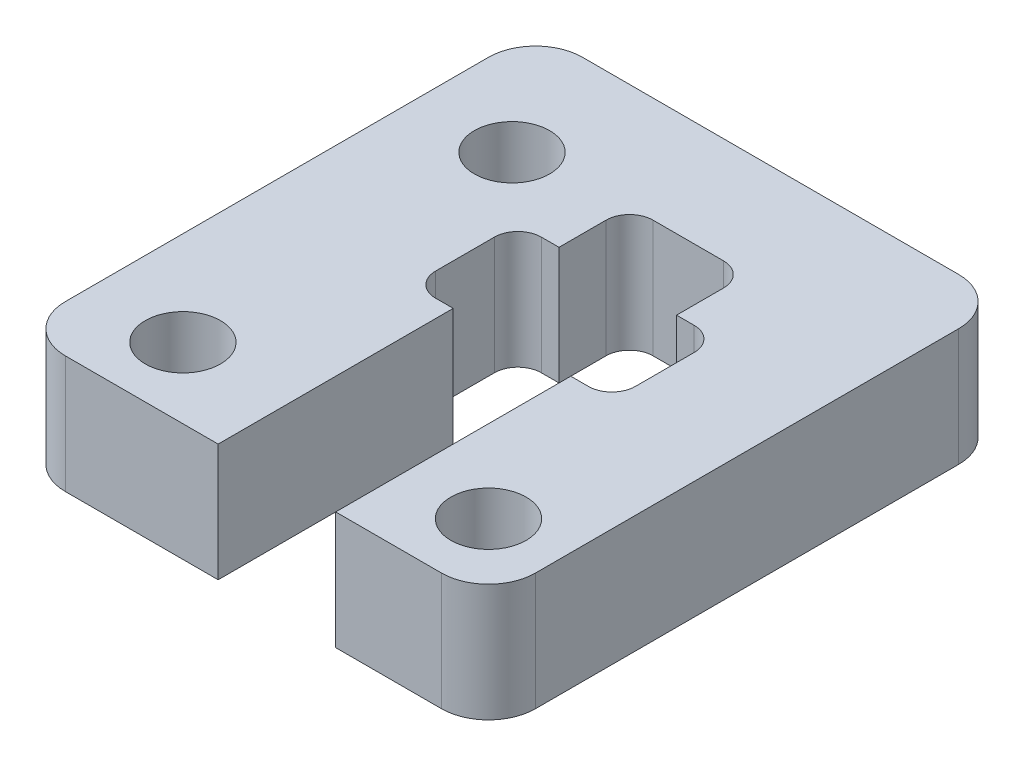
ISO-10303-21;
HEADER;
FILE_DESCRIPTION(('STEP AP214'),'2;1');
FILE_NAME('part.step','',(''),(''),'','','');
FILE_SCHEMA(('AUTOMOTIVE_DESIGN { 1 0 10303 214 1 1 1 1 }'));
ENDSEC;
DATA;
#1=APPLICATION_CONTEXT('core data for automotive mechanical design processes');
#2=APPLICATION_PROTOCOL_DEFINITION('international standard','automotive_design',2000,#1);
#3=PRODUCT_CONTEXT('',#1,'mechanical');
#4=PRODUCT('Part','Part','',(#3));
#5=PRODUCT_RELATED_PRODUCT_CATEGORY('part','',(#4));
#6=PRODUCT_DEFINITION_FORMATION('','',#4);
#7=PRODUCT_DEFINITION_CONTEXT('part definition',#1,'design');
#8=PRODUCT_DEFINITION('design','',#6,#7);
#9=PRODUCT_DEFINITION_SHAPE('','',#8);
#10=(LENGTH_UNIT() NAMED_UNIT(*) SI_UNIT(.MILLI.,.METRE.));
#11=(NAMED_UNIT(*) PLANE_ANGLE_UNIT() SI_UNIT($,.RADIAN.));
#12=(NAMED_UNIT(*) SI_UNIT($,.STERADIAN.) SOLID_ANGLE_UNIT());
#13=UNCERTAINTY_MEASURE_WITH_UNIT(LENGTH_MEASURE(1.E-05),#10,'distance_accuracy_value','');
#14=(GEOMETRIC_REPRESENTATION_CONTEXT(3) GLOBAL_UNCERTAINTY_ASSIGNED_CONTEXT((#13)) GLOBAL_UNIT_ASSIGNED_CONTEXT((#10,
#11,#12)) REPRESENTATION_CONTEXT('',''));
#15=CARTESIAN_POINT('',(0.,0.,0.));
#16=DIRECTION('',(0.,0.,1.));
#17=DIRECTION('',(1.,0.,0.));
#18=AXIS2_PLACEMENT_3D('',#15,#16,#17);
#19=CARTESIAN_POINT('',(0.,5.,0.));
#20=DIRECTION('',(0.,0.,-1.));
#21=DIRECTION('',(-1.,0.,0.));
#22=AXIS2_PLACEMENT_3D('',#19,#20,#21);
#23=PLANE('',#22);
#24=DIRECTION('',(1.,0.,0.));
#25=VECTOR('',#24,1.);
#26=CARTESIAN_POINT('',(0.,5.,0.));
#27=LINE('',#26,#25);
#28=CARTESIAN_POINT('',(3.5,5.,0.));
#29=VERTEX_POINT('',#28);
#30=CARTESIAN_POINT('',(4.25,5.,0.));
#31=VERTEX_POINT('',#30);
#32=EDGE_CURVE('E229',#29,#31,#27,.T.);
#33=ORIENTED_EDGE('',*,*,#32,.T.);
#34=DIRECTION('',(0.,-1.,0.));
#35=VECTOR('',#34,1.);
#36=CARTESIAN_POINT('',(4.25,0.,0.));
#37=LINE('',#36,#35);
#38=CARTESIAN_POINT('',(4.25,0.,0.));
#39=VERTEX_POINT('',#38);
#40=EDGE_CURVE('E352',#31,#39,#37,.T.);
#41=ORIENTED_EDGE('',*,*,#40,.T.);
#42=DIRECTION('',(1.,0.,0.));
#43=VECTOR('',#42,1.);
#44=CARTESIAN_POINT('',(0.,0.,0.));
#45=LINE('',#44,#43);
#46=CARTESIAN_POINT('',(3.5,0.,0.));
#47=VERTEX_POINT('',#46);
#48=EDGE_CURVE('E281',#47,#39,#45,.T.);
#49=ORIENTED_EDGE('',*,*,#48,.F.);
#50=DIRECTION('',(0.,-1.,0.));
#51=VECTOR('',#50,1.);
#52=CARTESIAN_POINT('',(3.5,5.,0.));
#53=LINE('',#52,#51);
#54=EDGE_CURVE('E266',#29,#47,#53,.T.);
#55=ORIENTED_EDGE('',*,*,#54,.F.);
#56=EDGE_LOOP('',(#33,#41,#49,#55));
#57=FACE_BOUND('',#56,.T.);
#58=ADVANCED_FACE('F36',(#57),#23,.T.);
#59=CARTESIAN_POINT('',(0.,5.,-4.5));
#60=DIRECTION('',(0.,0.,-1.));
#61=DIRECTION('',(-1.,0.,0.));
#62=AXIS2_PLACEMENT_3D('',#59,#60,#61);
#63=PLANE('',#62);
#64=DIRECTION('',(1.,0.,0.));
#65=VECTOR('',#64,1.);
#66=CARTESIAN_POINT('',(0.,0.,-4.5));
#67=LINE('',#66,#65);
#68=CARTESIAN_POINT('',(3.5,0.,-4.5));
#69=VERTEX_POINT('',#68);
#70=CARTESIAN_POINT('',(4.25,0.,-4.5));
#71=VERTEX_POINT('',#70);
#72=EDGE_CURVE('E287',#69,#71,#67,.T.);
#73=ORIENTED_EDGE('',*,*,#72,.T.);
#74=DIRECTION('',(0.,-1.,0.));
#75=VECTOR('',#74,1.);
#76=CARTESIAN_POINT('',(4.25,5.,-4.5));
#77=LINE('',#76,#75);
#78=CARTESIAN_POINT('',(4.25,5.,-4.5));
#79=VERTEX_POINT('',#78);
#80=EDGE_CURVE('E350',#71,#79,#77,.F.);
#81=ORIENTED_EDGE('',*,*,#80,.T.);
#82=DIRECTION('',(1.,0.,0.));
#83=VECTOR('',#82,1.);
#84=CARTESIAN_POINT('',(0.,5.,-4.5));
#85=LINE('',#84,#83);
#86=CARTESIAN_POINT('',(3.5,5.,-4.5));
#87=VERTEX_POINT('',#86);
#88=EDGE_CURVE('E252',#87,#79,#85,.T.);
#89=ORIENTED_EDGE('',*,*,#88,.F.);
#90=DIRECTION('',(0.,-1.,0.));
#91=VECTOR('',#90,1.);
#92=CARTESIAN_POINT('',(3.5,5.,-4.5));
#93=LINE('',#92,#91);
#94=EDGE_CURVE('E419',#87,#69,#93,.T.);
#95=ORIENTED_EDGE('',*,*,#94,.T.);
#96=EDGE_LOOP('',(#73,#81,#89,#95));
#97=FACE_BOUND('',#96,.T.);
#98=ADVANCED_FACE('F469',(#97),#63,.F.);
#99=CARTESIAN_POINT('',(0.,5.,10.));
#100=DIRECTION('',(0.,0.,-1.));
#101=DIRECTION('',(-1.,0.,0.));
#102=AXIS2_PLACEMENT_3D('',#99,#100,#101);
#103=PLANE('',#102);
#104=DIRECTION('',(1.,0.,0.));
#105=VECTOR('',#104,1.);
#106=CARTESIAN_POINT('',(0.,0.,10.));
#107=LINE('',#106,#105);
#108=CARTESIAN_POINT('',(3.5,0.,10.));
#109=VERTEX_POINT('',#108);
#110=CARTESIAN_POINT('',(8.,0.,10.));
#111=VERTEX_POINT('',#110);
#112=EDGE_CURVE('E275',#109,#111,#107,.T.);
#113=ORIENTED_EDGE('',*,*,#112,.T.);
#114=DIRECTION('',(0.,-1.,0.));
#115=VECTOR('',#114,1.);
#116=CARTESIAN_POINT('',(8.,5.,10.));
#117=LINE('',#116,#115);
#118=CARTESIAN_POINT('',(8.,5.,10.));
#119=VERTEX_POINT('',#118);
#120=EDGE_CURVE('E235',#111,#119,#117,.F.);
#121=ORIENTED_EDGE('',*,*,#120,.T.);
#122=DIRECTION('',(1.,0.,0.));
#123=VECTOR('',#122,1.);
#124=CARTESIAN_POINT('',(0.,5.,10.));
#125=LINE('',#124,#123);
#126=CARTESIAN_POINT('',(3.5,5.,10.));
#127=VERTEX_POINT('',#126);
#128=EDGE_CURVE('E226',#127,#119,#125,.T.);
#129=ORIENTED_EDGE('',*,*,#128,.F.);
#130=DIRECTION('',(0.,-1.,0.));
#131=VECTOR('',#130,1.);
#132=CARTESIAN_POINT('',(3.5,5.,10.));
#133=LINE('',#132,#131);
#134=EDGE_CURVE('E206',#127,#109,#133,.T.);
#135=ORIENTED_EDGE('',*,*,#134,.T.);
#136=EDGE_LOOP('',(#113,#121,#129,#135));
#137=FACE_BOUND('',#136,.T.);
#138=ADVANCED_FACE('F233',(#137),#103,.F.);
#139=CARTESIAN_POINT('',(5.25,5.,0.));
#140=DIRECTION('',(-1.,0.,0.));
#141=DIRECTION('',(0.,0.,1.));
#142=AXIS2_PLACEMENT_3D('',#139,#140,#141);
#143=PLANE('',#142);
#144=DIRECTION('',(0.,0.,-1.));
#145=VECTOR('',#144,1.);
#146=CARTESIAN_POINT('',(5.25,5.,0.));
#147=LINE('',#146,#145);
#148=CARTESIAN_POINT('',(5.25,5.,-1.));
#149=VERTEX_POINT('',#148);
#150=CARTESIAN_POINT('',(5.25,5.,-3.5));
#151=VERTEX_POINT('',#150);
#152=EDGE_CURVE('E239',#149,#151,#147,.T.);
#153=ORIENTED_EDGE('',*,*,#152,.T.);
#154=DIRECTION('',(0.,-1.,0.));
#155=VECTOR('',#154,1.);
#156=CARTESIAN_POINT('',(5.25,5.,-3.5));
#157=LINE('',#156,#155);
#158=CARTESIAN_POINT('',(5.25,0.,-3.5));
#159=VERTEX_POINT('',#158);
#160=EDGE_CURVE('E347',#151,#159,#157,.T.);
#161=ORIENTED_EDGE('',*,*,#160,.T.);
#162=DIRECTION('',(0.,0.,-1.));
#163=VECTOR('',#162,1.);
#164=CARTESIAN_POINT('',(5.25,0.,0.));
#165=LINE('',#164,#163);
#166=CARTESIAN_POINT('',(5.25,0.,-1.));
#167=VERTEX_POINT('',#166);
#168=EDGE_CURVE('E278',#167,#159,#165,.T.);
#169=ORIENTED_EDGE('',*,*,#168,.F.);
#170=DIRECTION('',(0.,-1.,0.));
#171=VECTOR('',#170,1.);
#172=CARTESIAN_POINT('',(5.25,5.,-1.));
#173=LINE('',#172,#171);
#174=EDGE_CURVE('E345',#167,#149,#173,.F.);
#175=ORIENTED_EDGE('',*,*,#174,.T.);
#176=EDGE_LOOP('',(#153,#161,#169,#175));
#177=FACE_BOUND('',#176,.T.);
#178=ADVANCED_FACE('F458',(#177),#143,.T.);
#179=CARTESIAN_POINT('',(-2.25,0.,0.));
#180=VERTEX_POINT('',#179);
#181=CARTESIAN_POINT('',(-1.5,0.,0.));
#182=VERTEX_POINT('',#181);
#183=EDGE_CURVE('E282',#180,#182,#45,.T.);
#184=ORIENTED_EDGE('',*,*,#183,.F.);
#185=DIRECTION('',(0.,-1.,0.));
#186=VECTOR('',#185,1.);
#187=CARTESIAN_POINT('',(-2.25,5.,0.));
#188=LINE('',#187,#186);
#189=CARTESIAN_POINT('',(-2.25,5.,0.));
#190=VERTEX_POINT('',#189);
#191=EDGE_CURVE('E51',#180,#190,#188,.F.);
#192=ORIENTED_EDGE('',*,*,#191,.T.);
#193=CARTESIAN_POINT('',(-1.5,5.,0.));
#194=VERTEX_POINT('',#193);
#195=EDGE_CURVE('E247',#190,#194,#27,.T.);
#196=ORIENTED_EDGE('',*,*,#195,.T.);
#197=DIRECTION('',(0.,1.,0.));
#198=VECTOR('',#197,1.);
#199=CARTESIAN_POINT('',(-1.5,5.,0.));
#200=LINE('',#199,#198);
#201=EDGE_CURVE('E411',#182,#194,#200,.T.);
#202=ORIENTED_EDGE('',*,*,#201,.F.);
#203=EDGE_LOOP('',(#184,#192,#196,#202));
#204=FACE_BOUND('',#203,.T.);
#205=ADVANCED_FACE('F410',(#204),#23,.T.);
#206=CARTESIAN_POINT('',(-3.25,5.,0.));
#207=DIRECTION('',(-1.,0.,0.));
#208=DIRECTION('',(0.,0.,1.));
#209=AXIS2_PLACEMENT_3D('',#206,#207,#208);
#210=PLANE('',#209);
#211=DIRECTION('',(0.,0.,-1.));
#212=VECTOR('',#211,1.);
#213=CARTESIAN_POINT('',(-3.25,0.,0.));
#214=LINE('',#213,#212);
#215=CARTESIAN_POINT('',(-3.25,0.,-1.));
#216=VERTEX_POINT('',#215);
#217=CARTESIAN_POINT('',(-3.25,0.,-3.5));
#218=VERTEX_POINT('',#217);
#219=EDGE_CURVE('E284',#216,#218,#214,.T.);
#220=ORIENTED_EDGE('',*,*,#219,.T.);
#221=DIRECTION('',(0.,-1.,0.));
#222=VECTOR('',#221,1.);
#223=CARTESIAN_POINT('',(-3.25,5.,-3.5));
#224=LINE('',#223,#222);
#225=CARTESIAN_POINT('',(-3.25,5.,-3.5));
#226=VERTEX_POINT('',#225);
#227=EDGE_CURVE('E361',#218,#226,#224,.F.);
#228=ORIENTED_EDGE('',*,*,#227,.T.);
#229=DIRECTION('',(0.,0.,-1.));
#230=VECTOR('',#229,1.);
#231=CARTESIAN_POINT('',(-3.25,5.,0.));
#232=LINE('',#231,#230);
#233=CARTESIAN_POINT('',(-3.25,5.,-1.));
#234=VERTEX_POINT('',#233);
#235=EDGE_CURVE('E249',#234,#226,#232,.T.);
#236=ORIENTED_EDGE('',*,*,#235,.F.);
#237=DIRECTION('',(0.,-1.,0.));
#238=VECTOR('',#237,1.);
#239=CARTESIAN_POINT('',(-3.25,5.,-1.));
#240=LINE('',#239,#238);
#241=EDGE_CURVE('E358',#234,#216,#240,.T.);
#242=ORIENTED_EDGE('',*,*,#241,.T.);
#243=EDGE_LOOP('',(#220,#228,#236,#242));
#244=FACE_BOUND('',#243,.T.);
#245=ADVANCED_FACE('F401',(#244),#210,.F.);
#246=CARTESIAN_POINT('',(10.,5.,0.));
#247=DIRECTION('',(1.,0.,0.));
#248=DIRECTION('',(0.,0.,-1.));
#249=AXIS2_PLACEMENT_3D('',#246,#247,#248);
#250=PLANE('',#249);
#251=DIRECTION('',(0.,0.,1.));
#252=VECTOR('',#251,1.);
#253=CARTESIAN_POINT('',(10.,0.,0.));
#254=LINE('',#253,#252);
#255=CARTESIAN_POINT('',(10.,0.,-10.));
#256=VERTEX_POINT('',#255);
#257=CARTESIAN_POINT('',(10.,0.,8.));
#258=VERTEX_POINT('',#257);
#259=EDGE_CURVE('E265',#256,#258,#254,.T.);
#260=ORIENTED_EDGE('',*,*,#259,.F.);
#261=DIRECTION('',(0.,-1.,0.));
#262=VECTOR('',#261,1.);
#263=CARTESIAN_POINT('',(10.,5.,-10.));
#264=LINE('',#263,#262);
#265=CARTESIAN_POINT('',(10.,5.,-10.));
#266=VERTEX_POINT('',#265);
#267=EDGE_CURVE('E316',#256,#266,#264,.F.);
#268=ORIENTED_EDGE('',*,*,#267,.T.);
#269=DIRECTION('',(0.,0.,1.));
#270=VECTOR('',#269,1.);
#271=CARTESIAN_POINT('',(10.,5.,0.));
#272=LINE('',#271,#270);
#273=CARTESIAN_POINT('',(10.,5.,8.));
#274=VERTEX_POINT('',#273);
#275=EDGE_CURVE('E428',#266,#274,#272,.T.);
#276=ORIENTED_EDGE('',*,*,#275,.T.);
#277=DIRECTION('',(0.,-1.,0.));
#278=VECTOR('',#277,1.);
#279=CARTESIAN_POINT('',(10.,0.,8.));
#280=LINE('',#279,#278);
#281=EDGE_CURVE('E313',#274,#258,#280,.T.);
#282=ORIENTED_EDGE('',*,*,#281,.T.);
#283=EDGE_LOOP('',(#260,#268,#276,#282));
#284=FACE_BOUND('',#283,.T.);
#285=ADVANCED_FACE('F444',(#284),#250,.T.);
#286=CARTESIAN_POINT('',(0.,5.,-12.));
#287=DIRECTION('',(0.,0.,-1.));
#288=DIRECTION('',(-1.,0.,0.));
#289=AXIS2_PLACEMENT_3D('',#286,#287,#288);
#290=PLANE('',#289);
#291=DIRECTION('',(1.,0.,0.));
#292=VECTOR('',#291,1.);
#293=CARTESIAN_POINT('',(0.,5.,-12.));
#294=LINE('',#293,#292);
#295=CARTESIAN_POINT('',(-8.,5.,-12.));
#296=VERTEX_POINT('',#295);
#297=CARTESIAN_POINT('',(8.,5.,-12.));
#298=VERTEX_POINT('',#297);
#299=EDGE_CURVE('E241',#296,#298,#294,.T.);
#300=ORIENTED_EDGE('',*,*,#299,.T.);
#301=DIRECTION('',(0.,-1.,0.));
#302=VECTOR('',#301,1.);
#303=CARTESIAN_POINT('',(8.,5.,-12.));
#304=LINE('',#303,#302);
#305=CARTESIAN_POINT('',(8.,0.,-12.));
#306=VERTEX_POINT('',#305);
#307=EDGE_CURVE('E302',#298,#306,#304,.T.);
#308=ORIENTED_EDGE('',*,*,#307,.T.);
#309=DIRECTION('',(1.,0.,0.));
#310=VECTOR('',#309,1.);
#311=CARTESIAN_POINT('',(0.,0.,-12.));
#312=LINE('',#311,#310);
#313=CARTESIAN_POINT('',(-8.,0.,-12.));
#314=VERTEX_POINT('',#313);
#315=EDGE_CURVE('E269',#314,#306,#312,.T.);
#316=ORIENTED_EDGE('',*,*,#315,.F.);
#317=DIRECTION('',(0.,-1.,0.));
#318=VECTOR('',#317,1.);
#319=CARTESIAN_POINT('',(-8.,5.,-12.));
#320=LINE('',#319,#318);
#321=EDGE_CURVE('E300',#314,#296,#320,.F.);
#322=ORIENTED_EDGE('',*,*,#321,.T.);
#323=EDGE_LOOP('',(#300,#308,#316,#322));
#324=FACE_BOUND('',#323,.T.);
#325=ADVANCED_FACE('F434',(#324),#290,.T.);
#326=CARTESIAN_POINT('',(-10.,5.,0.));
#327=DIRECTION('',(-1.,0.,0.));
#328=DIRECTION('',(0.,0.,1.));
#329=AXIS2_PLACEMENT_3D('',#326,#327,#328);
#330=PLANE('',#329);
#331=DIRECTION('',(0.,0.,-1.));
#332=VECTOR('',#331,1.);
#333=CARTESIAN_POINT('',(-10.,5.,0.));
#334=LINE('',#333,#332);
#335=CARTESIAN_POINT('',(-10.,5.,8.));
#336=VERTEX_POINT('',#335);
#337=CARTESIAN_POINT('',(-10.,5.,-10.));
#338=VERTEX_POINT('',#337);
#339=EDGE_CURVE('E237',#336,#338,#334,.T.);
#340=ORIENTED_EDGE('',*,*,#339,.T.);
#341=DIRECTION('',(0.,-1.,0.));
#342=VECTOR('',#341,1.);
#343=CARTESIAN_POINT('',(-10.,5.,-10.));
#344=LINE('',#343,#342);
#345=CARTESIAN_POINT('',(-10.,0.,-10.));
#346=VERTEX_POINT('',#345);
#347=EDGE_CURVE('E328',#338,#346,#344,.T.);
#348=ORIENTED_EDGE('',*,*,#347,.T.);
#349=DIRECTION('',(0.,0.,-1.));
#350=VECTOR('',#349,1.);
#351=CARTESIAN_POINT('',(-10.,0.,0.));
#352=LINE('',#351,#350);
#353=CARTESIAN_POINT('',(-10.,0.,8.));
#354=VERTEX_POINT('',#353);
#355=EDGE_CURVE('E272',#354,#346,#352,.T.);
#356=ORIENTED_EDGE('',*,*,#355,.F.);
#357=DIRECTION('',(0.,-1.,0.));
#358=VECTOR('',#357,1.);
#359=CARTESIAN_POINT('',(-10.,5.,8.));
#360=LINE('',#359,#358);
#361=EDGE_CURVE('E326',#354,#336,#360,.F.);
#362=ORIENTED_EDGE('',*,*,#361,.T.);
#363=EDGE_LOOP('',(#340,#348,#356,#362));
#364=FACE_BOUND('',#363,.T.);
#365=ADVANCED_FACE('F497',(#364),#330,.T.);
#366=CARTESIAN_POINT('',(-6.,5.,-7.));
#367=DIRECTION('',(0.,-1.,0.));
#368=DIRECTION('',(0.,0.,-1.));
#369=AXIS2_PLACEMENT_3D('',#366,#367,#368);
#370=CYLINDRICAL_SURFACE('',#369,1.6);
#371=CARTESIAN_POINT('',(-6.,5.,-7.));
#372=DIRECTION('',(0.,1.,0.));
#373=DIRECTION('',(0.,0.,1.));
#374=AXIS2_PLACEMENT_3D('',#371,#372,#373);
#375=CIRCLE('',#374,1.6);
#376=CARTESIAN_POINT('',(-6.,5.,-5.4));
#377=VERTEX_POINT('',#376);
#378=EDGE_CURVE('E255',#377,#377,#375,.T.);
#379=ORIENTED_EDGE('',*,*,#378,.T.);
#380=EDGE_LOOP('',(#379));
#381=FACE_BOUND('',#380,.T.);
#382=CARTESIAN_POINT('',(-6.,0.,-7.));
#383=DIRECTION('',(0.,1.,0.));
#384=DIRECTION('',(0.,0.,1.));
#385=AXIS2_PLACEMENT_3D('',#382,#383,#384);
#386=CIRCLE('',#385,1.6);
#387=CARTESIAN_POINT('',(-6.,0.,-5.4));
#388=VERTEX_POINT('',#387);
#389=EDGE_CURVE('E290',#388,#388,#386,.T.);
#390=ORIENTED_EDGE('',*,*,#389,.F.);
#391=EDGE_LOOP('',(#390));
#392=FACE_BOUND('',#391,.T.);
#393=ADVANCED_FACE('F531',(#381,#392),#370,.F.);
#394=CARTESIAN_POINT('',(-2.25,5.,-4.5));
#395=VERTEX_POINT('',#394);
#396=CARTESIAN_POINT('',(-1.5,5.,-4.5));
#397=VERTEX_POINT('',#396);
#398=EDGE_CURVE('E253',#395,#397,#85,.T.);
#399=ORIENTED_EDGE('',*,*,#398,.F.);
#400=DIRECTION('',(0.,-1.,0.));
#401=VECTOR('',#400,1.);
#402=CARTESIAN_POINT('',(-2.25,0.,-4.5));
#403=LINE('',#402,#401);
#404=CARTESIAN_POINT('',(-2.25,0.,-4.5));
#405=VERTEX_POINT('',#404);
#406=EDGE_CURVE('E355',#395,#405,#403,.T.);
#407=ORIENTED_EDGE('',*,*,#406,.T.);
#408=CARTESIAN_POINT('',(-1.5,0.,-4.5));
#409=VERTEX_POINT('',#408);
#410=EDGE_CURVE('E288',#405,#409,#67,.T.);
#411=ORIENTED_EDGE('',*,*,#410,.T.);
#412=DIRECTION('',(0.,1.,0.));
#413=VECTOR('',#412,1.);
#414=CARTESIAN_POINT('',(-1.5,5.,-4.5));
#415=LINE('',#414,#413);
#416=EDGE_CURVE('E396',#409,#397,#415,.T.);
#417=ORIENTED_EDGE('',*,*,#416,.T.);
#418=EDGE_LOOP('',(#399,#407,#411,#417));
#419=FACE_BOUND('',#418,.T.);
#420=ADVANCED_FACE('F393',(#419),#63,.F.);
#421=CARTESIAN_POINT('',(-8.,5.,10.));
#422=VERTEX_POINT('',#421);
#423=CARTESIAN_POINT('',(-1.5,5.,10.));
#424=VERTEX_POINT('',#423);
#425=EDGE_CURVE('E236',#422,#424,#125,.T.);
#426=ORIENTED_EDGE('',*,*,#425,.F.);
#427=DIRECTION('',(0.,-1.,0.));
#428=VECTOR('',#427,1.);
#429=CARTESIAN_POINT('',(-8.,0.,10.));
#430=LINE('',#429,#428);
#431=CARTESIAN_POINT('',(-8.,0.,10.));
#432=VERTEX_POINT('',#431);
#433=EDGE_CURVE('E331',#422,#432,#430,.T.);
#434=ORIENTED_EDGE('',*,*,#433,.T.);
#435=CARTESIAN_POINT('',(-1.5,0.,10.));
#436=VERTEX_POINT('',#435);
#437=EDGE_CURVE('E276',#432,#436,#107,.T.);
#438=ORIENTED_EDGE('',*,*,#437,.T.);
#439=DIRECTION('',(0.,-1.,0.));
#440=VECTOR('',#439,1.);
#441=CARTESIAN_POINT('',(-1.5,5.,10.));
#442=LINE('',#441,#440);
#443=EDGE_CURVE('E217',#424,#436,#442,.T.);
#444=ORIENTED_EDGE('',*,*,#443,.F.);
#445=EDGE_LOOP('',(#426,#434,#438,#444));
#446=FACE_BOUND('',#445,.T.);
#447=ADVANCED_FACE('F489',(#446),#103,.F.);
#448=CARTESIAN_POINT('',(7.,5.,7.));
#449=DIRECTION('',(0.,-1.,0.));
#450=DIRECTION('',(0.,0.,-1.));
#451=AXIS2_PLACEMENT_3D('',#448,#449,#450);
#452=CYLINDRICAL_SURFACE('',#451,1.6);
#453=CARTESIAN_POINT('',(7.,5.,7.));
#454=DIRECTION('',(0.,1.,0.));
#455=DIRECTION('',(0.,0.,1.));
#456=AXIS2_PLACEMENT_3D('',#453,#454,#455);
#457=CIRCLE('',#456,1.6);
#458=CARTESIAN_POINT('',(7.,5.,8.6));
#459=VERTEX_POINT('',#458);
#460=EDGE_CURVE('E296',#459,#459,#457,.T.);
#461=ORIENTED_EDGE('',*,*,#460,.T.);
#462=EDGE_LOOP('',(#461));
#463=FACE_BOUND('',#462,.T.);
#464=CARTESIAN_POINT('',(7.,0.,7.));
#465=DIRECTION('',(0.,1.,0.));
#466=DIRECTION('',(0.,0.,1.));
#467=AXIS2_PLACEMENT_3D('',#464,#465,#466);
#468=CIRCLE('',#467,1.6);
#469=CARTESIAN_POINT('',(7.,0.,8.6));
#470=VERTEX_POINT('',#469);
#471=EDGE_CURVE('E262',#470,#470,#468,.T.);
#472=ORIENTED_EDGE('',*,*,#471,.F.);
#473=EDGE_LOOP('',(#472));
#474=FACE_BOUND('',#473,.T.);
#475=ADVANCED_FACE('F528',(#463,#474),#452,.F.);
#476=CARTESIAN_POINT('',(-6.,5.,7.));
#477=DIRECTION('',(0.,-1.,0.));
#478=DIRECTION('',(0.,0.,-1.));
#479=AXIS2_PLACEMENT_3D('',#476,#477,#478);
#480=CYLINDRICAL_SURFACE('',#479,1.6);
#481=CARTESIAN_POINT('',(-6.,5.,7.));
#482=DIRECTION('',(0.,1.,0.));
#483=DIRECTION('',(0.,0.,1.));
#484=AXIS2_PLACEMENT_3D('',#481,#482,#483);
#485=CIRCLE('',#484,1.6);
#486=CARTESIAN_POINT('',(-6.,5.,8.6));
#487=VERTEX_POINT('',#486);
#488=EDGE_CURVE('E258',#487,#487,#485,.F.);
#489=ORIENTED_EDGE('',*,*,#488,.F.);
#490=EDGE_LOOP('',(#489));
#491=FACE_BOUND('',#490,.T.);
#492=CARTESIAN_POINT('',(-6.,0.,7.));
#493=DIRECTION('',(0.,1.,0.));
#494=DIRECTION('',(0.,0.,1.));
#495=AXIS2_PLACEMENT_3D('',#492,#493,#494);
#496=CIRCLE('',#495,1.6);
#497=CARTESIAN_POINT('',(-6.,0.,8.6));
#498=VERTEX_POINT('',#497);
#499=EDGE_CURVE('E293',#498,#498,#496,.F.);
#500=ORIENTED_EDGE('',*,*,#499,.T.);
#501=EDGE_LOOP('',(#500));
#502=FACE_BOUND('',#501,.T.);
#503=ADVANCED_FACE('F537',(#491,#502),#480,.F.);
#504=CARTESIAN_POINT('',(0.,5.,0.));
#505=DIRECTION('',(0.,1.,0.));
#506=DIRECTION('',(0.,0.,1.));
#507=AXIS2_PLACEMENT_3D('',#504,#505,#506);
#508=PLANE('',#507);
#509=ORIENTED_EDGE('',*,*,#275,.F.);
#510=CARTESIAN_POINT('',(8.,5.,-10.));
#511=DIRECTION('',(0.,1.,0.));
#512=DIRECTION('',(0.,0.,1.));
#513=AXIS2_PLACEMENT_3D('',#510,#511,#512);
#514=CIRCLE('',#513,2.);
#515=EDGE_CURVE('E324',#266,#298,#514,.T.);
#516=ORIENTED_EDGE('',*,*,#515,.T.);
#517=ORIENTED_EDGE('',*,*,#299,.F.);
#518=CARTESIAN_POINT('',(-8.,5.,-10.));
#519=DIRECTION('',(0.,1.,0.));
#520=DIRECTION('',(0.,0.,1.));
#521=AXIS2_PLACEMENT_3D('',#518,#519,#520);
#522=CIRCLE('',#521,2.);
#523=EDGE_CURVE('E322',#296,#338,#522,.T.);
#524=ORIENTED_EDGE('',*,*,#523,.T.);
#525=ORIENTED_EDGE('',*,*,#339,.F.);
#526=CARTESIAN_POINT('',(-8.,5.,8.));
#527=DIRECTION('',(0.,1.,0.));
#528=DIRECTION('',(0.,0.,1.));
#529=AXIS2_PLACEMENT_3D('',#526,#527,#528);
#530=CIRCLE('',#529,2.);
#531=EDGE_CURVE('E320',#336,#422,#530,.T.);
#532=ORIENTED_EDGE('',*,*,#531,.T.);
#533=ORIENTED_EDGE('',*,*,#425,.T.);
#534=DIRECTION('',(0.,0.,-1.));
#535=VECTOR('',#534,1.);
#536=CARTESIAN_POINT('',(-1.5,5.,10.));
#537=LINE('',#536,#535);
#538=EDGE_CURVE('E407',#424,#194,#537,.T.);
#539=ORIENTED_EDGE('',*,*,#538,.T.);
#540=ORIENTED_EDGE('',*,*,#195,.F.);
#541=CARTESIAN_POINT('',(-2.25,5.,-1.));
#542=DIRECTION('',(0.,1.,0.));
#543=DIRECTION('',(0.,0.,1.));
#544=AXIS2_PLACEMENT_3D('',#541,#542,#543);
#545=CIRCLE('',#544,1.);
#546=EDGE_CURVE('E11',#190,#234,#545,.F.);
#547=ORIENTED_EDGE('',*,*,#546,.T.);
#548=ORIENTED_EDGE('',*,*,#235,.T.);
#549=CARTESIAN_POINT('',(-2.25,5.,-3.5));
#550=DIRECTION('',(0.,1.,0.));
#551=DIRECTION('',(0.,0.,1.));
#552=AXIS2_PLACEMENT_3D('',#549,#550,#551);
#553=CIRCLE('',#552,1.);
#554=EDGE_CURVE('E382',#226,#395,#553,.F.);
#555=ORIENTED_EDGE('',*,*,#554,.T.);
#556=ORIENTED_EDGE('',*,*,#398,.T.);
#557=CARTESIAN_POINT('',(-1.5,5.,-6.5));
#558=VERTEX_POINT('',#557);
#559=EDGE_CURVE('E770',#397,#558,#537,.T.);
#560=ORIENTED_EDGE('',*,*,#559,.T.);
#561=CARTESIAN_POINT('',(-0.5,5.,-6.5));
#562=DIRECTION('',(0.,1.,0.));
#563=DIRECTION('',(0.,0.,1.));
#564=AXIS2_PLACEMENT_3D('',#561,#562,#563);
#565=CIRCLE('',#564,1.);
#566=CARTESIAN_POINT('',(-0.5,5.,-7.5));
#567=VERTEX_POINT('',#566);
#568=EDGE_CURVE('E366',#558,#567,#565,.F.);
#569=ORIENTED_EDGE('',*,*,#568,.T.);
#570=DIRECTION('',(1.,0.,0.));
#571=VECTOR('',#570,1.);
#572=CARTESIAN_POINT('',(-1.5,5.,-7.5));
#573=LINE('',#572,#571);
#574=CARTESIAN_POINT('',(2.5,5.,-7.5));
#575=VERTEX_POINT('',#574);
#576=EDGE_CURVE('E218',#567,#575,#573,.T.);
#577=ORIENTED_EDGE('',*,*,#576,.T.);
#578=CARTESIAN_POINT('',(2.5,5.,-6.5));
#579=DIRECTION('',(0.,1.,0.));
#580=DIRECTION('',(0.,0.,1.));
#581=AXIS2_PLACEMENT_3D('',#578,#579,#580);
#582=CIRCLE('',#581,1.);
#583=CARTESIAN_POINT('',(3.5,5.,-6.5));
#584=VERTEX_POINT('',#583);
#585=EDGE_CURVE('E370',#575,#584,#582,.F.);
#586=ORIENTED_EDGE('',*,*,#585,.T.);
#587=DIRECTION('',(0.,0.,1.));
#588=VECTOR('',#587,1.);
#589=CARTESIAN_POINT('',(3.5,5.,10.));
#590=LINE('',#589,#588);
#591=EDGE_CURVE('E230',#584,#87,#590,.T.);
#592=ORIENTED_EDGE('',*,*,#591,.T.);
#593=ORIENTED_EDGE('',*,*,#88,.T.);
#594=CARTESIAN_POINT('',(4.25,5.,-3.5));
#595=DIRECTION('',(0.,1.,0.));
#596=DIRECTION('',(0.,0.,1.));
#597=AXIS2_PLACEMENT_3D('',#594,#595,#596);
#598=CIRCLE('',#597,1.);
#599=EDGE_CURVE('E374',#79,#151,#598,.F.);
#600=ORIENTED_EDGE('',*,*,#599,.T.);
#601=ORIENTED_EDGE('',*,*,#152,.F.);
#602=CARTESIAN_POINT('',(4.25,5.,-1.));
#603=DIRECTION('',(0.,1.,0.));
#604=DIRECTION('',(0.,0.,1.));
#605=AXIS2_PLACEMENT_3D('',#602,#603,#604);
#606=CIRCLE('',#605,1.);
#607=EDGE_CURVE('E378',#149,#31,#606,.F.);
#608=ORIENTED_EDGE('',*,*,#607,.T.);
#609=ORIENTED_EDGE('',*,*,#32,.F.);
#610=EDGE_CURVE('E209',#29,#127,#590,.T.);
#611=ORIENTED_EDGE('',*,*,#610,.T.);
#612=ORIENTED_EDGE('',*,*,#128,.T.);
#613=CARTESIAN_POINT('',(8.,5.,8.));
#614=DIRECTION('',(0.,1.,0.));
#615=DIRECTION('',(0.,0.,1.));
#616=AXIS2_PLACEMENT_3D('',#613,#614,#615);
#617=CIRCLE('',#616,2.);
#618=EDGE_CURVE('E318',#119,#274,#617,.T.);
#619=ORIENTED_EDGE('',*,*,#618,.T.);
#620=EDGE_LOOP('',(#509,#516,#517,#524,#525,#532,#533,#539,#540,#547,#548,#555,#556,#560,#569,
#577,#586,#592,#593,#600,#601,#608,#609,#611,#612,#619));
#621=FACE_BOUND('',#620,.T.);
#622=ORIENTED_EDGE('',*,*,#460,.F.);
#623=EDGE_LOOP('',(#622));
#624=FACE_BOUND('',#623,.T.);
#625=ORIENTED_EDGE('',*,*,#378,.F.);
#626=EDGE_LOOP('',(#625));
#627=FACE_BOUND('',#626,.T.);
#628=ORIENTED_EDGE('',*,*,#488,.T.);
#629=EDGE_LOOP('',(#628));
#630=FACE_BOUND('',#629,.T.);
#631=ADVANCED_FACE('F224',(#621,#624,#627,#630),#508,.T.);
#632=CARTESIAN_POINT('',(0.,0.,0.));
#633=DIRECTION('',(0.,1.,0.));
#634=DIRECTION('',(0.,0.,1.));
#635=AXIS2_PLACEMENT_3D('',#632,#633,#634);
#636=PLANE('',#635);
#637=ORIENTED_EDGE('',*,*,#471,.T.);
#638=EDGE_LOOP('',(#637));
#639=FACE_BOUND('',#638,.T.);
#640=ORIENTED_EDGE('',*,*,#315,.T.);
#641=CARTESIAN_POINT('',(8.,0.,-10.));
#642=DIRECTION('',(0.,1.,0.));
#643=DIRECTION('',(0.,0.,1.));
#644=AXIS2_PLACEMENT_3D('',#641,#642,#643);
#645=CIRCLE('',#644,2.);
#646=EDGE_CURVE('E311',#306,#256,#645,.F.);
#647=ORIENTED_EDGE('',*,*,#646,.T.);
#648=ORIENTED_EDGE('',*,*,#259,.T.);
#649=CARTESIAN_POINT('',(8.,0.,8.));
#650=DIRECTION('',(0.,1.,0.));
#651=DIRECTION('',(0.,0.,1.));
#652=AXIS2_PLACEMENT_3D('',#649,#650,#651);
#653=CIRCLE('',#652,2.);
#654=EDGE_CURVE('E305',#258,#111,#653,.F.);
#655=ORIENTED_EDGE('',*,*,#654,.T.);
#656=ORIENTED_EDGE('',*,*,#112,.F.);
#657=DIRECTION('',(0.,0.,-1.));
#658=VECTOR('',#657,1.);
#659=CARTESIAN_POINT('',(3.5,0.,0.));
#660=LINE('',#659,#658);
#661=EDGE_CURVE('E212',#109,#47,#660,.T.);
#662=ORIENTED_EDGE('',*,*,#661,.T.);
#663=ORIENTED_EDGE('',*,*,#48,.T.);
#664=CARTESIAN_POINT('',(4.25,0.,-1.));
#665=DIRECTION('',(0.,1.,0.));
#666=DIRECTION('',(0.,0.,1.));
#667=AXIS2_PLACEMENT_3D('',#664,#665,#666);
#668=CIRCLE('',#667,1.);
#669=EDGE_CURVE('E376',#39,#167,#668,.T.);
#670=ORIENTED_EDGE('',*,*,#669,.T.);
#671=ORIENTED_EDGE('',*,*,#168,.T.);
#672=CARTESIAN_POINT('',(4.25,0.,-3.5));
#673=DIRECTION('',(0.,1.,0.));
#674=DIRECTION('',(0.,0.,1.));
#675=AXIS2_PLACEMENT_3D('',#672,#673,#674);
#676=CIRCLE('',#675,1.);
#677=EDGE_CURVE('E372',#159,#71,#676,.T.);
#678=ORIENTED_EDGE('',*,*,#677,.T.);
#679=ORIENTED_EDGE('',*,*,#72,.F.);
#680=DIRECTION('',(0.,0.,1.));
#681=VECTOR('',#680,1.);
#682=CARTESIAN_POINT('',(3.5,0.,10.));
#683=LINE('',#682,#681);
#684=CARTESIAN_POINT('',(3.5,0.,-6.5));
#685=VERTEX_POINT('',#684);
#686=EDGE_CURVE('E477',#685,#69,#683,.T.);
#687=ORIENTED_EDGE('',*,*,#686,.F.);
#688=CARTESIAN_POINT('',(2.5,0.,-6.5));
#689=DIRECTION('',(0.,1.,0.));
#690=DIRECTION('',(0.,0.,1.));
#691=AXIS2_PLACEMENT_3D('',#688,#689,#690);
#692=CIRCLE('',#691,1.);
#693=CARTESIAN_POINT('',(2.5,0.,-7.5));
#694=VERTEX_POINT('',#693);
#695=EDGE_CURVE('E368',#685,#694,#692,.T.);
#696=ORIENTED_EDGE('',*,*,#695,.T.);
#697=DIRECTION('',(1.,0.,0.));
#698=VECTOR('',#697,1.);
#699=CARTESIAN_POINT('',(-1.5,0.,-7.5));
#700=LINE('',#699,#698);
#701=CARTESIAN_POINT('',(-0.5,0.,-7.5));
#702=VERTEX_POINT('',#701);
#703=EDGE_CURVE('E231',#702,#694,#700,.T.);
#704=ORIENTED_EDGE('',*,*,#703,.F.);
#705=CARTESIAN_POINT('',(-0.5,0.,-6.5));
#706=DIRECTION('',(0.,1.,0.));
#707=DIRECTION('',(0.,0.,1.));
#708=AXIS2_PLACEMENT_3D('',#705,#706,#707);
#709=CIRCLE('',#708,1.);
#710=CARTESIAN_POINT('',(-1.5,0.,-6.5));
#711=VERTEX_POINT('',#710);
#712=EDGE_CURVE('E364',#702,#711,#709,.T.);
#713=ORIENTED_EDGE('',*,*,#712,.T.);
#714=DIRECTION('',(0.,0.,1.));
#715=VECTOR('',#714,1.);
#716=CARTESIAN_POINT('',(-1.5,0.,0.));
#717=LINE('',#716,#715);
#718=EDGE_CURVE('E261',#711,#409,#717,.T.);
#719=ORIENTED_EDGE('',*,*,#718,.T.);
#720=ORIENTED_EDGE('',*,*,#410,.F.);
#721=CARTESIAN_POINT('',(-2.25,0.,-3.5));
#722=DIRECTION('',(0.,1.,0.));
#723=DIRECTION('',(0.,0.,1.));
#724=AXIS2_PLACEMENT_3D('',#721,#722,#723);
#725=CIRCLE('',#724,1.);
#726=EDGE_CURVE('E380',#405,#218,#725,.T.);
#727=ORIENTED_EDGE('',*,*,#726,.T.);
#728=ORIENTED_EDGE('',*,*,#219,.F.);
#729=CARTESIAN_POINT('',(-2.25,0.,-1.));
#730=DIRECTION('',(0.,1.,0.));
#731=DIRECTION('',(0.,0.,1.));
#732=AXIS2_PLACEMENT_3D('',#729,#730,#731);
#733=CIRCLE('',#732,1.);
#734=EDGE_CURVE('E44',#216,#180,#733,.T.);
#735=ORIENTED_EDGE('',*,*,#734,.T.);
#736=ORIENTED_EDGE('',*,*,#183,.T.);
#737=DIRECTION('',(0.,0.,-1.));
#738=VECTOR('',#737,1.);
#739=CARTESIAN_POINT('',(-1.5,0.,10.));
#740=LINE('',#739,#738);
#741=EDGE_CURVE('E418',#436,#182,#740,.T.);
#742=ORIENTED_EDGE('',*,*,#741,.F.);
#743=ORIENTED_EDGE('',*,*,#437,.F.);
#744=CARTESIAN_POINT('',(-8.,0.,8.));
#745=DIRECTION('',(0.,1.,0.));
#746=DIRECTION('',(0.,0.,1.));
#747=AXIS2_PLACEMENT_3D('',#744,#745,#746);
#748=CIRCLE('',#747,2.);
#749=EDGE_CURVE('E307',#432,#354,#748,.F.);
#750=ORIENTED_EDGE('',*,*,#749,.T.);
#751=ORIENTED_EDGE('',*,*,#355,.T.);
#752=CARTESIAN_POINT('',(-8.,0.,-10.));
#753=DIRECTION('',(0.,1.,0.));
#754=DIRECTION('',(0.,0.,1.));
#755=AXIS2_PLACEMENT_3D('',#752,#753,#754);
#756=CIRCLE('',#755,2.);
#757=EDGE_CURVE('E309',#346,#314,#756,.F.);
#758=ORIENTED_EDGE('',*,*,#757,.T.);
#759=EDGE_LOOP('',(#640,#647,#648,#655,#656,#662,#663,#670,#671,#678,#679,#687,#696,#704,#713,
#719,#720,#727,#728,#735,#736,#742,#743,#750,#751,#758));
#760=FACE_BOUND('',#759,.T.);
#761=ORIENTED_EDGE('',*,*,#389,.T.);
#762=EDGE_LOOP('',(#761));
#763=FACE_BOUND('',#762,.T.);
#764=ORIENTED_EDGE('',*,*,#499,.F.);
#765=EDGE_LOOP('',(#764));
#766=FACE_BOUND('',#765,.T.);
#767=ADVANCED_FACE('F398',(#639,#760,#763,#766),#636,.F.);
#768=CARTESIAN_POINT('',(-1.5,5.,10.));
#769=DIRECTION('',(-1.,0.,0.));
#770=DIRECTION('',(0.,0.,1.));
#771=AXIS2_PLACEMENT_3D('',#768,#769,#770);
#772=PLANE('',#771);
#773=ORIENTED_EDGE('',*,*,#201,.T.);
#774=ORIENTED_EDGE('',*,*,#538,.F.);
#775=ORIENTED_EDGE('',*,*,#443,.T.);
#776=ORIENTED_EDGE('',*,*,#741,.T.);
#777=EDGE_LOOP('',(#773,#774,#775,#776));
#778=FACE_BOUND('',#777,.T.);
#779=ADVANCED_FACE('F414',(#778),#772,.F.);
#780=ORIENTED_EDGE('',*,*,#718,.F.);
#781=DIRECTION('',(0.,-1.,0.));
#782=VECTOR('',#781,1.);
#783=CARTESIAN_POINT('',(-1.5,5.,-6.5));
#784=LINE('',#783,#782);
#785=EDGE_CURVE('E340',#711,#558,#784,.F.);
#786=ORIENTED_EDGE('',*,*,#785,.T.);
#787=ORIENTED_EDGE('',*,*,#559,.F.);
#788=ORIENTED_EDGE('',*,*,#416,.F.);
#789=EDGE_LOOP('',(#780,#786,#787,#788));
#790=FACE_BOUND('',#789,.T.);
#791=ADVANCED_FACE('F554',(#790),#772,.F.);
#792=CARTESIAN_POINT('',(-1.5,5.,-7.5));
#793=DIRECTION('',(0.,0.,-1.));
#794=DIRECTION('',(-1.,0.,0.));
#795=AXIS2_PLACEMENT_3D('',#792,#793,#794);
#796=PLANE('',#795);
#797=ORIENTED_EDGE('',*,*,#576,.F.);
#798=DIRECTION('',(0.,-1.,0.));
#799=VECTOR('',#798,1.);
#800=CARTESIAN_POINT('',(-0.5,0.,-7.5));
#801=LINE('',#800,#799);
#802=EDGE_CURVE('E337',#567,#702,#801,.T.);
#803=ORIENTED_EDGE('',*,*,#802,.T.);
#804=ORIENTED_EDGE('',*,*,#703,.T.);
#805=DIRECTION('',(0.,-1.,0.));
#806=VECTOR('',#805,1.);
#807=CARTESIAN_POINT('',(2.5,5.,-7.5));
#808=LINE('',#807,#806);
#809=EDGE_CURVE('E335',#694,#575,#808,.F.);
#810=ORIENTED_EDGE('',*,*,#809,.T.);
#811=EDGE_LOOP('',(#797,#803,#804,#810));
#812=FACE_BOUND('',#811,.T.);
#813=ADVANCED_FACE('F699',(#812),#796,.F.);
#814=CARTESIAN_POINT('',(3.5,5.,10.));
#815=DIRECTION('',(1.,0.,0.));
#816=DIRECTION('',(0.,0.,-1.));
#817=AXIS2_PLACEMENT_3D('',#814,#815,#816);
#818=PLANE('',#817);
#819=ORIENTED_EDGE('',*,*,#591,.F.);
#820=DIRECTION('',(0.,-1.,0.));
#821=VECTOR('',#820,1.);
#822=CARTESIAN_POINT('',(3.5,0.,-6.5));
#823=LINE('',#822,#821);
#824=EDGE_CURVE('E342',#584,#685,#823,.T.);
#825=ORIENTED_EDGE('',*,*,#824,.T.);
#826=ORIENTED_EDGE('',*,*,#686,.T.);
#827=ORIENTED_EDGE('',*,*,#94,.F.);
#828=EDGE_LOOP('',(#819,#825,#826,#827));
#829=FACE_BOUND('',#828,.T.);
#830=ADVANCED_FACE('F475',(#829),#818,.F.);
#831=ORIENTED_EDGE('',*,*,#54,.T.);
#832=ORIENTED_EDGE('',*,*,#661,.F.);
#833=ORIENTED_EDGE('',*,*,#134,.F.);
#834=ORIENTED_EDGE('',*,*,#610,.F.);
#835=EDGE_LOOP('',(#831,#832,#833,#834));
#836=FACE_BOUND('',#835,.T.);
#837=ADVANCED_FACE('F208',(#836),#818,.F.);
#838=CARTESIAN_POINT('',(8.,5.,-10.));
#839=DIRECTION('',(0.,-1.,0.));
#840=DIRECTION('',(0.,0.,-1.));
#841=AXIS2_PLACEMENT_3D('',#838,#839,#840);
#842=CYLINDRICAL_SURFACE('',#841,2.);
#843=ORIENTED_EDGE('',*,*,#515,.F.);
#844=ORIENTED_EDGE('',*,*,#267,.F.);
#845=ORIENTED_EDGE('',*,*,#646,.F.);
#846=ORIENTED_EDGE('',*,*,#307,.F.);
#847=EDGE_LOOP('',(#843,#844,#845,#846));
#848=FACE_BOUND('',#847,.T.);
#849=ADVANCED_FACE('F440',(#848),#842,.T.);
#850=CARTESIAN_POINT('',(-8.,5.,-10.));
#851=DIRECTION('',(0.,-1.,0.));
#852=DIRECTION('',(0.,0.,-1.));
#853=AXIS2_PLACEMENT_3D('',#850,#851,#852);
#854=CYLINDRICAL_SURFACE('',#853,2.);
#855=ORIENTED_EDGE('',*,*,#523,.F.);
#856=ORIENTED_EDGE('',*,*,#321,.F.);
#857=ORIENTED_EDGE('',*,*,#757,.F.);
#858=ORIENTED_EDGE('',*,*,#347,.F.);
#859=EDGE_LOOP('',(#855,#856,#857,#858));
#860=FACE_BOUND('',#859,.T.);
#861=ADVANCED_FACE('F500',(#860),#854,.T.);
#862=CARTESIAN_POINT('',(-8.,5.,8.));
#863=DIRECTION('',(0.,1.,0.));
#864=DIRECTION('',(0.,0.,1.));
#865=AXIS2_PLACEMENT_3D('',#862,#863,#864);
#866=CYLINDRICAL_SURFACE('',#865,2.);
#867=ORIENTED_EDGE('',*,*,#531,.F.);
#868=ORIENTED_EDGE('',*,*,#361,.F.);
#869=ORIENTED_EDGE('',*,*,#749,.F.);
#870=ORIENTED_EDGE('',*,*,#433,.F.);
#871=EDGE_LOOP('',(#867,#868,#869,#870));
#872=FACE_BOUND('',#871,.T.);
#873=ADVANCED_FACE('F493',(#872),#866,.T.);
#874=CARTESIAN_POINT('',(8.,5.,8.));
#875=DIRECTION('',(0.,1.,0.));
#876=DIRECTION('',(0.,0.,1.));
#877=AXIS2_PLACEMENT_3D('',#874,#875,#876);
#878=CYLINDRICAL_SURFACE('',#877,2.);
#879=ORIENTED_EDGE('',*,*,#618,.F.);
#880=ORIENTED_EDGE('',*,*,#120,.F.);
#881=ORIENTED_EDGE('',*,*,#654,.F.);
#882=ORIENTED_EDGE('',*,*,#281,.F.);
#883=EDGE_LOOP('',(#879,#880,#881,#882));
#884=FACE_BOUND('',#883,.T.);
#885=ADVANCED_FACE('F447',(#884),#878,.T.);
#886=CARTESIAN_POINT('',(-0.5,5.,-6.5));
#887=DIRECTION('',(0.,1.,0.));
#888=DIRECTION('',(0.,0.,1.));
#889=AXIS2_PLACEMENT_3D('',#886,#887,#888);
#890=CYLINDRICAL_SURFACE('',#889,1.);
#891=ORIENTED_EDGE('',*,*,#568,.F.);
#892=ORIENTED_EDGE('',*,*,#785,.F.);
#893=ORIENTED_EDGE('',*,*,#712,.F.);
#894=ORIENTED_EDGE('',*,*,#802,.F.);
#895=EDGE_LOOP('',(#891,#892,#893,#894));
#896=FACE_BOUND('',#895,.T.);
#897=ADVANCED_FACE('F603',(#896),#890,.F.);
#898=CARTESIAN_POINT('',(2.5,5.,-6.5));
#899=DIRECTION('',(0.,1.,0.));
#900=DIRECTION('',(0.,0.,1.));
#901=AXIS2_PLACEMENT_3D('',#898,#899,#900);
#902=CYLINDRICAL_SURFACE('',#901,1.);
#903=ORIENTED_EDGE('',*,*,#585,.F.);
#904=ORIENTED_EDGE('',*,*,#809,.F.);
#905=ORIENTED_EDGE('',*,*,#695,.F.);
#906=ORIENTED_EDGE('',*,*,#824,.F.);
#907=EDGE_LOOP('',(#903,#904,#905,#906));
#908=FACE_BOUND('',#907,.T.);
#909=ADVANCED_FACE('F720',(#908),#902,.F.);
#910=CARTESIAN_POINT('',(4.25,5.,-3.5));
#911=DIRECTION('',(0.,-1.,0.));
#912=DIRECTION('',(0.,0.,-1.));
#913=AXIS2_PLACEMENT_3D('',#910,#911,#912);
#914=CYLINDRICAL_SURFACE('',#913,1.);
#915=ORIENTED_EDGE('',*,*,#599,.F.);
#916=ORIENTED_EDGE('',*,*,#80,.F.);
#917=ORIENTED_EDGE('',*,*,#677,.F.);
#918=ORIENTED_EDGE('',*,*,#160,.F.);
#919=EDGE_LOOP('',(#915,#916,#917,#918));
#920=FACE_BOUND('',#919,.T.);
#921=ADVANCED_FACE('F463',(#920),#914,.F.);
#922=CARTESIAN_POINT('',(4.25,5.,-1.));
#923=DIRECTION('',(0.,1.,0.));
#924=DIRECTION('',(0.,0.,1.));
#925=AXIS2_PLACEMENT_3D('',#922,#923,#924);
#926=CYLINDRICAL_SURFACE('',#925,1.);
#927=ORIENTED_EDGE('',*,*,#607,.F.);
#928=ORIENTED_EDGE('',*,*,#174,.F.);
#929=ORIENTED_EDGE('',*,*,#669,.F.);
#930=ORIENTED_EDGE('',*,*,#40,.F.);
#931=EDGE_LOOP('',(#927,#928,#929,#930));
#932=FACE_BOUND('',#931,.T.);
#933=ADVANCED_FACE('F454',(#932),#926,.F.);
#934=CARTESIAN_POINT('',(-2.25,5.,-3.5));
#935=DIRECTION('',(0.,1.,0.));
#936=DIRECTION('',(0.,0.,1.));
#937=AXIS2_PLACEMENT_3D('',#934,#935,#936);
#938=CYLINDRICAL_SURFACE('',#937,1.);
#939=ORIENTED_EDGE('',*,*,#554,.F.);
#940=ORIENTED_EDGE('',*,*,#227,.F.);
#941=ORIENTED_EDGE('',*,*,#726,.F.);
#942=ORIENTED_EDGE('',*,*,#406,.F.);
#943=EDGE_LOOP('',(#939,#940,#941,#942));
#944=FACE_BOUND('',#943,.T.);
#945=ADVANCED_FACE('F397',(#944),#938,.F.);
#946=CARTESIAN_POINT('',(-2.25,5.,-1.));
#947=DIRECTION('',(0.,-1.,0.));
#948=DIRECTION('',(0.,0.,-1.));
#949=AXIS2_PLACEMENT_3D('',#946,#947,#948);
#950=CYLINDRICAL_SURFACE('',#949,1.);
#951=ORIENTED_EDGE('',*,*,#546,.F.);
#952=ORIENTED_EDGE('',*,*,#191,.F.);
#953=ORIENTED_EDGE('',*,*,#734,.F.);
#954=ORIENTED_EDGE('',*,*,#241,.F.);
#955=EDGE_LOOP('',(#951,#952,#953,#954));
#956=FACE_BOUND('',#955,.T.);
#957=ADVANCED_FACE('F38',(#956),#950,.F.);
#958=CLOSED_SHELL('',(#58,#98,#138,#178,#205,#245,#285,#325,#365,#393,#420,#447,#475,#503,#631,
#767,#779,#791,#813,#830,#837,#849,#861,#873,#885,#897,#909,#921,#933,#945,#957));
#959=MANIFOLD_SOLID_BREP('B2',#958);
#960=ADVANCED_BREP_SHAPE_REPRESENTATION('',(#18,#959),#14);
#961=SHAPE_DEFINITION_REPRESENTATION(#9,#960);
ENDSEC;
END-ISO-10303-21;
